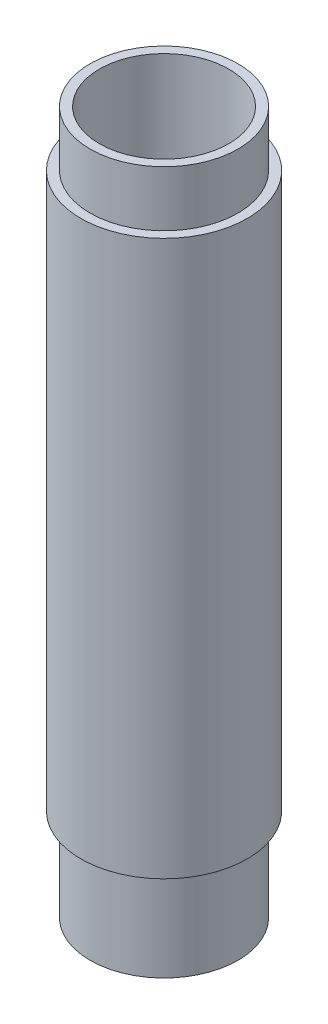
ISO-10303-21;
HEADER;
FILE_DESCRIPTION(('STEP AP214'),'2;1');
FILE_NAME('part.step','',(''),(''),'','','');
FILE_SCHEMA(('AUTOMOTIVE_DESIGN { 1 0 10303 214 1 1 1 1 }'));
ENDSEC;
DATA;
#1=APPLICATION_CONTEXT('core data for automotive mechanical design processes');
#2=APPLICATION_PROTOCOL_DEFINITION('international standard','automotive_design',2000,#1);
#3=PRODUCT_CONTEXT('',#1,'mechanical');
#4=PRODUCT('Part','Part','',(#3));
#5=PRODUCT_RELATED_PRODUCT_CATEGORY('part','',(#4));
#6=PRODUCT_DEFINITION_FORMATION('','',#4);
#7=PRODUCT_DEFINITION_CONTEXT('part definition',#1,'design');
#8=PRODUCT_DEFINITION('design','',#6,#7);
#9=PRODUCT_DEFINITION_SHAPE('','',#8);
#10=(LENGTH_UNIT() NAMED_UNIT(*) SI_UNIT(.MILLI.,.METRE.));
#11=(NAMED_UNIT(*) PLANE_ANGLE_UNIT() SI_UNIT($,.RADIAN.));
#12=(NAMED_UNIT(*) SI_UNIT($,.STERADIAN.) SOLID_ANGLE_UNIT());
#13=UNCERTAINTY_MEASURE_WITH_UNIT(LENGTH_MEASURE(1.E-05),#10,'distance_accuracy_value','');
#14=(GEOMETRIC_REPRESENTATION_CONTEXT(3) GLOBAL_UNCERTAINTY_ASSIGNED_CONTEXT((#13)) GLOBAL_UNIT_ASSIGNED_CONTEXT((#10,
#11,#12)) REPRESENTATION_CONTEXT('',''));
#15=CARTESIAN_POINT('',(0.,0.,0.));
#16=DIRECTION('',(0.,0.,1.));
#17=DIRECTION('',(1.,0.,0.));
#18=AXIS2_PLACEMENT_3D('',#15,#16,#17);
#19=CARTESIAN_POINT('',(0.,15.,0.));
#20=DIRECTION('',(0.,-1.,0.));
#21=DIRECTION('',(0.,0.,-1.));
#22=AXIS2_PLACEMENT_3D('',#19,#20,#21);
#23=CYLINDRICAL_SURFACE('',#22,8.);
#24=CARTESIAN_POINT('',(0.,0.,0.));
#25=DIRECTION('',(0.,1.,0.));
#26=DIRECTION('',(0.,0.,1.));
#27=AXIS2_PLACEMENT_3D('',#24,#25,#26);
#28=CIRCLE('',#27,8.);
#29=CARTESIAN_POINT('',(0.,0.,8.));
#30=VERTEX_POINT('',#29);
#31=EDGE_CURVE('E46',#30,#30,#28,.T.);
#32=ORIENTED_EDGE('',*,*,#31,.T.);
#33=EDGE_LOOP('',(#32));
#34=FACE_BOUND('',#33,.T.);
#35=CARTESIAN_POINT('',(0.,10.,0.));
#36=DIRECTION('',(0.,1.,0.));
#37=DIRECTION('',(0.,0.,1.));
#38=AXIS2_PLACEMENT_3D('',#35,#36,#37);
#39=CIRCLE('',#38,8.);
#40=CARTESIAN_POINT('',(0.,10.,8.));
#41=VERTEX_POINT('',#40);
#42=EDGE_CURVE('E10',#41,#41,#39,.T.);
#43=ORIENTED_EDGE('',*,*,#42,.F.);
#44=EDGE_LOOP('',(#43));
#45=FACE_BOUND('',#44,.T.);
#46=ADVANCED_FACE('F39',(#34,#45),#23,.T.);
#47=CARTESIAN_POINT('',(0.,0.,0.));
#48=DIRECTION('',(0.,1.,0.));
#49=DIRECTION('',(0.,0.,1.));
#50=AXIS2_PLACEMENT_3D('',#47,#48,#49);
#51=PLANE('',#50);
#52=ORIENTED_EDGE('',*,*,#31,.F.);
#53=EDGE_LOOP('',(#52));
#54=FACE_BOUND('',#53,.T.);
#55=CARTESIAN_POINT('',(0.,0.,0.));
#56=DIRECTION('',(0.,1.,0.));
#57=DIRECTION('',(0.,0.,1.));
#58=AXIS2_PLACEMENT_3D('',#55,#56,#57);
#59=CIRCLE('',#58,7.);
#60=CARTESIAN_POINT('',(0.,0.,7.));
#61=VERTEX_POINT('',#60);
#62=EDGE_CURVE('E51',#61,#61,#59,.T.);
#63=ORIENTED_EDGE('',*,*,#62,.T.);
#64=EDGE_LOOP('',(#63));
#65=FACE_BOUND('',#64,.T.);
#66=ADVANCED_FACE('F98',(#54,#65),#51,.F.);
#67=CARTESIAN_POINT('',(0.,15.,0.));
#68=DIRECTION('',(0.,-1.,0.));
#69=DIRECTION('',(0.,0.,-1.));
#70=AXIS2_PLACEMENT_3D('',#67,#68,#69);
#71=CYLINDRICAL_SURFACE('',#70,7.);
#72=CARTESIAN_POINT('',(0.,76.,0.));
#73=DIRECTION('',(0.,1.,0.));
#74=DIRECTION('',(0.,0.,1.));
#75=AXIS2_PLACEMENT_3D('',#72,#73,#74);
#76=CIRCLE('',#75,7.);
#77=CARTESIAN_POINT('',(0.,76.,7.));
#78=VERTEX_POINT('',#77);
#79=EDGE_CURVE('E74',#78,#78,#76,.T.);
#80=ORIENTED_EDGE('',*,*,#79,.T.);
#81=EDGE_LOOP('',(#80));
#82=FACE_BOUND('',#81,.T.);
#83=ORIENTED_EDGE('',*,*,#62,.F.);
#84=EDGE_LOOP('',(#83));
#85=FACE_BOUND('',#84,.T.);
#86=ADVANCED_FACE('F79',(#82,#85),#71,.F.);
#87=CARTESIAN_POINT('',(0.,70.,0.));
#88=DIRECTION('',(0.,1.,0.));
#89=DIRECTION('',(0.,0.,1.));
#90=AXIS2_PLACEMENT_3D('',#87,#88,#89);
#91=PLANE('',#90);
#92=CARTESIAN_POINT('',(0.,70.,0.));
#93=DIRECTION('',(0.,1.,0.));
#94=DIRECTION('',(0.,0.,1.));
#95=AXIS2_PLACEMENT_3D('',#92,#93,#94);
#96=CIRCLE('',#95,9.);
#97=CARTESIAN_POINT('',(0.,70.,-9.));
#98=VERTEX_POINT('',#97);
#99=EDGE_CURVE('E56',#98,#98,#96,.T.);
#100=ORIENTED_EDGE('',*,*,#99,.T.);
#101=EDGE_LOOP('',(#100));
#102=FACE_BOUND('',#101,.T.);
#103=CARTESIAN_POINT('',(0.,70.,0.));
#104=DIRECTION('',(0.,1.,0.));
#105=DIRECTION('',(0.,0.,1.));
#106=AXIS2_PLACEMENT_3D('',#103,#104,#105);
#107=CIRCLE('',#106,8.);
#108=CARTESIAN_POINT('',(0.,70.,8.));
#109=VERTEX_POINT('',#108);
#110=EDGE_CURVE('E63',#109,#109,#107,.T.);
#111=ORIENTED_EDGE('',*,*,#110,.F.);
#112=EDGE_LOOP('',(#111));
#113=FACE_BOUND('',#112,.T.);
#114=ADVANCED_FACE('F107',(#102,#113),#91,.T.);
#115=CARTESIAN_POINT('',(0.,10.,0.));
#116=DIRECTION('',(0.,1.,0.));
#117=DIRECTION('',(0.,0.,1.));
#118=AXIS2_PLACEMENT_3D('',#115,#116,#117);
#119=PLANE('',#118);
#120=CARTESIAN_POINT('',(0.,10.,0.));
#121=DIRECTION('',(0.,1.,0.));
#122=DIRECTION('',(0.,0.,1.));
#123=AXIS2_PLACEMENT_3D('',#120,#121,#122);
#124=CIRCLE('',#123,9.);
#125=CARTESIAN_POINT('',(0.,10.,-9.));
#126=VERTEX_POINT('',#125);
#127=EDGE_CURVE('E59',#126,#126,#124,.T.);
#128=ORIENTED_EDGE('',*,*,#127,.F.);
#129=EDGE_LOOP('',(#128));
#130=FACE_BOUND('',#129,.T.);
#131=ORIENTED_EDGE('',*,*,#42,.T.);
#132=EDGE_LOOP('',(#131));
#133=FACE_BOUND('',#132,.T.);
#134=ADVANCED_FACE('F94',(#130,#133),#119,.F.);
#135=CARTESIAN_POINT('',(0.,70.,0.));
#136=DIRECTION('',(0.,-1.,0.));
#137=DIRECTION('',(0.,0.,-1.));
#138=AXIS2_PLACEMENT_3D('',#135,#136,#137);
#139=CYLINDRICAL_SURFACE('',#138,9.);
#140=CARTESIAN_POINT('',(0.,70.,-9.));
#141=CARTESIAN_POINT('',(0.,69.375,-9.));
#142=CARTESIAN_POINT('',(0.,68.75,-9.));
#143=CARTESIAN_POINT('',(0.,67.5,-9.));
#144=CARTESIAN_POINT('',(0.,66.875,-9.));
#145=CARTESIAN_POINT('',(0.,65.625,-9.));
#146=CARTESIAN_POINT('',(0.,65.,-9.));
#147=CARTESIAN_POINT('',(0.,63.75,-9.));
#148=CARTESIAN_POINT('',(0.,63.125,-9.));
#149=CARTESIAN_POINT('',(0.,61.875,-9.));
#150=CARTESIAN_POINT('',(0.,61.25,-9.));
#151=CARTESIAN_POINT('',(0.,60.,-9.));
#152=CARTESIAN_POINT('',(0.,59.375,-9.));
#153=CARTESIAN_POINT('',(0.,58.125,-9.));
#154=CARTESIAN_POINT('',(0.,57.5,-9.));
#155=CARTESIAN_POINT('',(0.,56.25,-9.));
#156=CARTESIAN_POINT('',(0.,55.625,-9.));
#157=CARTESIAN_POINT('',(0.,54.375,-9.));
#158=CARTESIAN_POINT('',(0.,53.75,-9.));
#159=CARTESIAN_POINT('',(0.,52.5,-9.));
#160=CARTESIAN_POINT('',(0.,51.875,-9.));
#161=CARTESIAN_POINT('',(0.,50.625,-9.));
#162=CARTESIAN_POINT('',(0.,50.,-9.));
#163=CARTESIAN_POINT('',(0.,48.75,-9.));
#164=CARTESIAN_POINT('',(0.,48.125,-9.));
#165=CARTESIAN_POINT('',(0.,46.875,-9.));
#166=CARTESIAN_POINT('',(0.,46.25,-9.));
#167=CARTESIAN_POINT('',(0.,45.,-9.));
#168=CARTESIAN_POINT('',(0.,44.375,-9.));
#169=CARTESIAN_POINT('',(0.,43.125,-9.));
#170=CARTESIAN_POINT('',(0.,42.5,-9.));
#171=CARTESIAN_POINT('',(0.,41.25,-9.));
#172=CARTESIAN_POINT('',(0.,40.625,-9.));
#173=CARTESIAN_POINT('',(0.,39.375,-9.));
#174=CARTESIAN_POINT('',(0.,38.75,-9.));
#175=CARTESIAN_POINT('',(0.,37.5,-9.));
#176=CARTESIAN_POINT('',(0.,36.875,-9.));
#177=CARTESIAN_POINT('',(0.,35.625,-9.));
#178=CARTESIAN_POINT('',(0.,35.,-9.));
#179=CARTESIAN_POINT('',(0.,33.75,-9.));
#180=CARTESIAN_POINT('',(0.,33.125,-9.));
#181=CARTESIAN_POINT('',(0.,31.875,-9.));
#182=CARTESIAN_POINT('',(0.,31.25,-9.));
#183=CARTESIAN_POINT('',(0.,30.,-9.));
#184=CARTESIAN_POINT('',(0.,29.375,-9.));
#185=CARTESIAN_POINT('',(0.,28.125,-9.));
#186=CARTESIAN_POINT('',(0.,27.5,-9.));
#187=CARTESIAN_POINT('',(0.,26.25,-9.));
#188=CARTESIAN_POINT('',(0.,25.625,-9.));
#189=CARTESIAN_POINT('',(0.,24.375,-9.));
#190=CARTESIAN_POINT('',(0.,23.75,-9.));
#191=CARTESIAN_POINT('',(0.,22.5,-9.));
#192=CARTESIAN_POINT('',(0.,21.875,-9.));
#193=CARTESIAN_POINT('',(0.,20.625,-9.));
#194=CARTESIAN_POINT('',(0.,20.,-9.));
#195=CARTESIAN_POINT('',(0.,18.75,-9.));
#196=CARTESIAN_POINT('',(0.,18.125,-9.));
#197=CARTESIAN_POINT('',(0.,16.875,-9.));
#198=CARTESIAN_POINT('',(0.,16.25,-9.));
#199=CARTESIAN_POINT('',(0.,15.,-9.));
#200=CARTESIAN_POINT('',(0.,14.375,-9.));
#201=CARTESIAN_POINT('',(0.,13.125,-9.));
#202=CARTESIAN_POINT('',(0.,12.5,-9.));
#203=CARTESIAN_POINT('',(0.,11.25,-9.));
#204=CARTESIAN_POINT('',(0.,10.625,-9.));
#205=CARTESIAN_POINT('',(0.,10.,-9.));
#206=B_SPLINE_CURVE_WITH_KNOTS('',3,(#140,#141,#142,#143,#144,#145,#146,#147,#148,#149,#150,
#151,#152,#153,#154,#155,#156,#157,#158,#159,#160,#161,#162,#163,#164,#165,#166,#167,#168,#169,
#170,#171,#172,#173,#174,#175,#176,#177,#178,#179,#180,#181,#182,#183,#184,#185,#186,#187,#188,
#189,#190,#191,#192,#193,#194,#195,#196,#197,#198,#199,#200,#201,#202,#203,#204,#205),
.UNSPECIFIED.,.F.,.F.,(4,2,2,2,2,2,2,2,2,2,2,2,2,2,2,2,2,2,2,2,2,2,2,2,2,2,2,2,2,2,2,2,4),(0.,
1.87499999999999,3.74999999999999,5.62499999999999,7.49999999999999,9.37499999999999,11.25,
13.125,15.,16.875,18.75,20.625,22.5,24.375,26.25,28.125,30.,31.875,33.75,35.625,37.5,39.375,
41.25,43.125,45.,46.875,48.75,50.625,52.5,54.375,56.25,58.125,60.),.UNSPECIFIED.);
#207=EDGE_CURVE('BSEAM85',#98,#126,#206,.T.);
#208=ORIENTED_EDGE('',*,*,#99,.F.);
#209=ORIENTED_EDGE('',*,*,#127,.T.);
#210=ORIENTED_EDGE('',*,*,#207,.T.);
#211=ORIENTED_EDGE('',*,*,#207,.F.);
#212=EDGE_LOOP('',(#208,#210,#209,#211));
#213=FACE_BOUND('',#212,.T.);
#214=ADVANCED_FACE('F85',(#213),#139,.T.);
#215=CARTESIAN_POINT('',(0.,76.,0.));
#216=DIRECTION('',(0.,1.,0.));
#217=DIRECTION('',(0.,0.,1.));
#218=AXIS2_PLACEMENT_3D('',#215,#216,#217);
#219=PLANE('',#218);
#220=CARTESIAN_POINT('',(0.,76.,0.));
#221=DIRECTION('',(0.,1.,0.));
#222=DIRECTION('',(0.,0.,1.));
#223=AXIS2_PLACEMENT_3D('',#220,#221,#222);
#224=CIRCLE('',#223,8.);
#225=CARTESIAN_POINT('',(0.,76.,8.));
#226=VERTEX_POINT('',#225);
#227=EDGE_CURVE('E70',#226,#226,#224,.T.);
#228=ORIENTED_EDGE('',*,*,#227,.T.);
#229=EDGE_LOOP('',(#228));
#230=FACE_BOUND('',#229,.T.);
#231=ORIENTED_EDGE('',*,*,#79,.F.);
#232=EDGE_LOOP('',(#231));
#233=FACE_BOUND('',#232,.T.);
#234=ADVANCED_FACE('F82',(#230,#233),#219,.T.);
#235=CARTESIAN_POINT('',(0.,76.,0.));
#236=DIRECTION('',(0.,-1.,0.));
#237=DIRECTION('',(0.,0.,-1.));
#238=AXIS2_PLACEMENT_3D('',#235,#236,#237);
#239=CYLINDRICAL_SURFACE('',#238,8.);
#240=ORIENTED_EDGE('',*,*,#110,.T.);
#241=EDGE_LOOP('',(#240));
#242=FACE_BOUND('',#241,.T.);
#243=ORIENTED_EDGE('',*,*,#227,.F.);
#244=EDGE_LOOP('',(#243));
#245=FACE_BOUND('',#244,.T.);
#246=ADVANCED_FACE('F84',(#242,#245),#239,.T.);
#247=CLOSED_SHELL('',(#46,#66,#86,#114,#134,#214,#234,#246));
#248=MANIFOLD_SOLID_BREP('B2',#247);
#249=ADVANCED_BREP_SHAPE_REPRESENTATION('',(#18,#248),#14);
#250=SHAPE_DEFINITION_REPRESENTATION(#9,#249);
ENDSEC;
END-ISO-10303-21;
